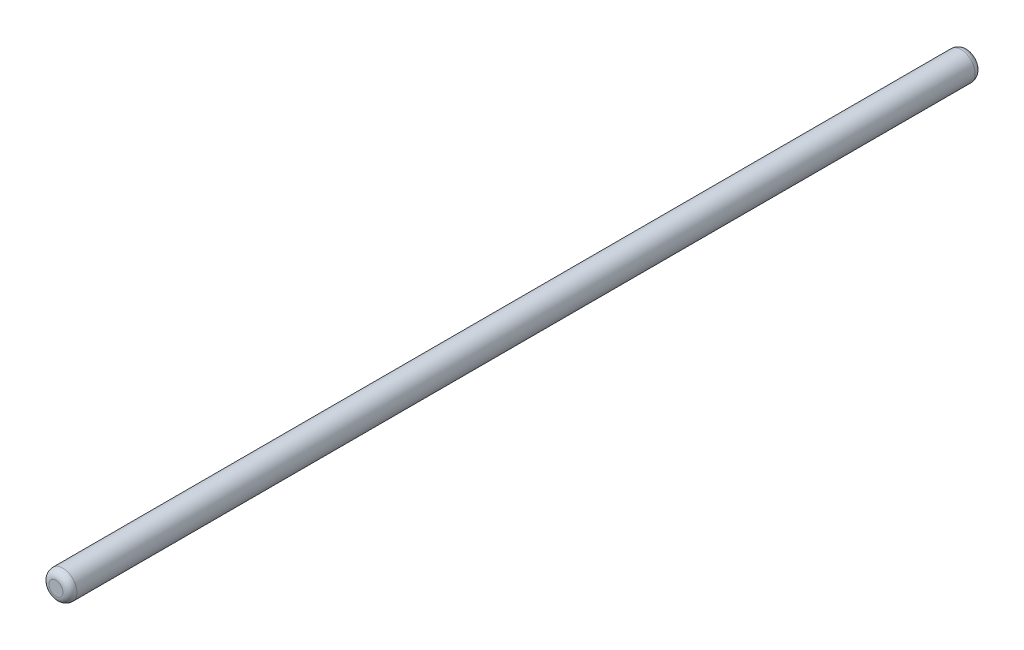
ISO-10303-21;
HEADER;
FILE_DESCRIPTION(('STEP AP214'),'2;1');
FILE_NAME('part.step','',(''),(''),'','','');
FILE_SCHEMA(('AUTOMOTIVE_DESIGN { 1 0 10303 214 1 1 1 1 }'));
ENDSEC;
DATA;
#1=APPLICATION_CONTEXT('core data for automotive mechanical design processes');
#2=APPLICATION_PROTOCOL_DEFINITION('international standard','automotive_design',2000,#1);
#3=PRODUCT_CONTEXT('',#1,'mechanical');
#4=PRODUCT('Part','Part','',(#3));
#5=PRODUCT_RELATED_PRODUCT_CATEGORY('part','',(#4));
#6=PRODUCT_DEFINITION_FORMATION('','',#4);
#7=PRODUCT_DEFINITION_CONTEXT('part definition',#1,'design');
#8=PRODUCT_DEFINITION('design','',#6,#7);
#9=PRODUCT_DEFINITION_SHAPE('','',#8);
#10=(LENGTH_UNIT() NAMED_UNIT(*) SI_UNIT(.MILLI.,.METRE.));
#11=(NAMED_UNIT(*) PLANE_ANGLE_UNIT() SI_UNIT($,.RADIAN.));
#12=(NAMED_UNIT(*) SI_UNIT($,.STERADIAN.) SOLID_ANGLE_UNIT());
#13=UNCERTAINTY_MEASURE_WITH_UNIT(LENGTH_MEASURE(1.E-05),#10,'distance_accuracy_value','');
#14=(GEOMETRIC_REPRESENTATION_CONTEXT(3) GLOBAL_UNCERTAINTY_ASSIGNED_CONTEXT((#13)) GLOBAL_UNIT_ASSIGNED_CONTEXT((#10,
#11,#12)) REPRESENTATION_CONTEXT('',''));
#15=CARTESIAN_POINT('',(0.,0.,0.));
#16=DIRECTION('',(0.,0.,1.));
#17=DIRECTION('',(1.,0.,0.));
#18=AXIS2_PLACEMENT_3D('',#15,#16,#17);
#19=CARTESIAN_POINT('',(0.,0.,260.525021330774));
#20=DIRECTION('',(0.,0.,-1.));
#21=DIRECTION('',(-1.,0.,0.));
#22=AXIS2_PLACEMENT_3D('',#19,#20,#21);
#23=CYLINDRICAL_SURFACE('',#22,4.);
#24=CARTESIAN_POINT('',(0.,0.,258.525021330774));
#25=DIRECTION('',(0.,0.,1.));
#26=DIRECTION('',(1.,0.,0.));
#27=AXIS2_PLACEMENT_3D('',#24,#25,#26);
#28=CIRCLE('',#27,4.);
#29=CARTESIAN_POINT('',(4.,0.,258.525021330774));
#30=VERTEX_POINT('',#29);
#31=EDGE_CURVE('E42',#30,#30,#28,.F.);
#32=ORIENTED_EDGE('',*,*,#31,.T.);
#33=EDGE_LOOP('',(#32));
#34=FACE_BOUND('',#33,.T.);
#35=CARTESIAN_POINT('',(0.,0.,2.));
#36=DIRECTION('',(0.,0.,1.));
#37=DIRECTION('',(1.,0.,0.));
#38=AXIS2_PLACEMENT_3D('',#35,#36,#37);
#39=CIRCLE('',#38,4.);
#40=CARTESIAN_POINT('',(4.,0.,2.));
#41=VERTEX_POINT('',#40);
#42=EDGE_CURVE('E46',#41,#41,#39,.T.);
#43=ORIENTED_EDGE('',*,*,#42,.T.);
#44=EDGE_LOOP('',(#43));
#45=FACE_BOUND('',#44,.T.);
#46=ADVANCED_FACE('F35',(#34,#45),#23,.T.);
#47=CARTESIAN_POINT('',(0.,0.,260.525021330774));
#48=DIRECTION('',(0.,0.,1.));
#49=DIRECTION('',(1.,0.,0.));
#50=AXIS2_PLACEMENT_3D('',#47,#48,#49);
#51=PLANE('',#50);
#52=CARTESIAN_POINT('',(0.,0.,260.525021330774));
#53=DIRECTION('',(0.,0.,1.));
#54=DIRECTION('',(1.,0.,0.));
#55=AXIS2_PLACEMENT_3D('',#52,#53,#54);
#56=CIRCLE('',#55,2.);
#57=CARTESIAN_POINT('',(2.,0.,260.525021330774));
#58=VERTEX_POINT('',#57);
#59=EDGE_CURVE('E50',#58,#58,#56,.T.);
#60=ORIENTED_EDGE('',*,*,#59,.T.);
#61=EDGE_LOOP('',(#60));
#62=FACE_BOUND('',#61,.T.);
#63=ADVANCED_FACE('F56',(#62),#51,.T.);
#64=CARTESIAN_POINT('',(0.,0.,0.));
#65=DIRECTION('',(0.,0.,1.));
#66=DIRECTION('',(1.,0.,0.));
#67=AXIS2_PLACEMENT_3D('',#64,#65,#66);
#68=PLANE('',#67);
#69=CARTESIAN_POINT('',(0.,0.,0.));
#70=DIRECTION('',(0.,0.,1.));
#71=DIRECTION('',(1.,0.,0.));
#72=AXIS2_PLACEMENT_3D('',#69,#70,#71);
#73=CIRCLE('',#72,2.);
#74=CARTESIAN_POINT('',(2.,0.,0.));
#75=VERTEX_POINT('',#74);
#76=EDGE_CURVE('E10',#75,#75,#73,.F.);
#77=ORIENTED_EDGE('',*,*,#76,.T.);
#78=EDGE_LOOP('',(#77));
#79=FACE_BOUND('',#78,.T.);
#80=ADVANCED_FACE('F60',(#79),#68,.F.);
#81=CARTESIAN_POINT('',(0.,0.,258.525021330774));
#82=DIRECTION('',(0.,0.,1.));
#83=DIRECTION('',(1.,0.,0.));
#84=AXIS2_PLACEMENT_3D('',#81,#82,#83);
#85=DEGENERATE_TOROIDAL_SURFACE('',#84,2.,2.,.T.);
#86=ORIENTED_EDGE('',*,*,#31,.F.);
#87=EDGE_LOOP('',(#86));
#88=FACE_BOUND('',#87,.T.);
#89=ORIENTED_EDGE('',*,*,#59,.F.);
#90=EDGE_LOOP('',(#89));
#91=FACE_BOUND('',#90,.T.);
#92=ADVANCED_FACE('F58',(#88,#91),#85,.T.);
#93=CARTESIAN_POINT('',(0.,0.,2.));
#94=DIRECTION('',(0.,0.,1.));
#95=DIRECTION('',(1.,0.,0.));
#96=AXIS2_PLACEMENT_3D('',#93,#94,#95);
#97=DEGENERATE_TOROIDAL_SURFACE('',#96,2.,2.,.T.);
#98=ORIENTED_EDGE('',*,*,#76,.F.);
#99=EDGE_LOOP('',(#98));
#100=FACE_BOUND('',#99,.T.);
#101=ORIENTED_EDGE('',*,*,#42,.F.);
#102=EDGE_LOOP('',(#101));
#103=FACE_BOUND('',#102,.T.);
#104=ADVANCED_FACE('F37',(#100,#103),#97,.T.);
#105=CLOSED_SHELL('',(#46,#63,#80,#92,#104));
#106=MANIFOLD_SOLID_BREP('B2',#105);
#107=ADVANCED_BREP_SHAPE_REPRESENTATION('',(#18,#106),#14);
#108=SHAPE_DEFINITION_REPRESENTATION(#9,#107);
ENDSEC;
END-ISO-10303-21;
